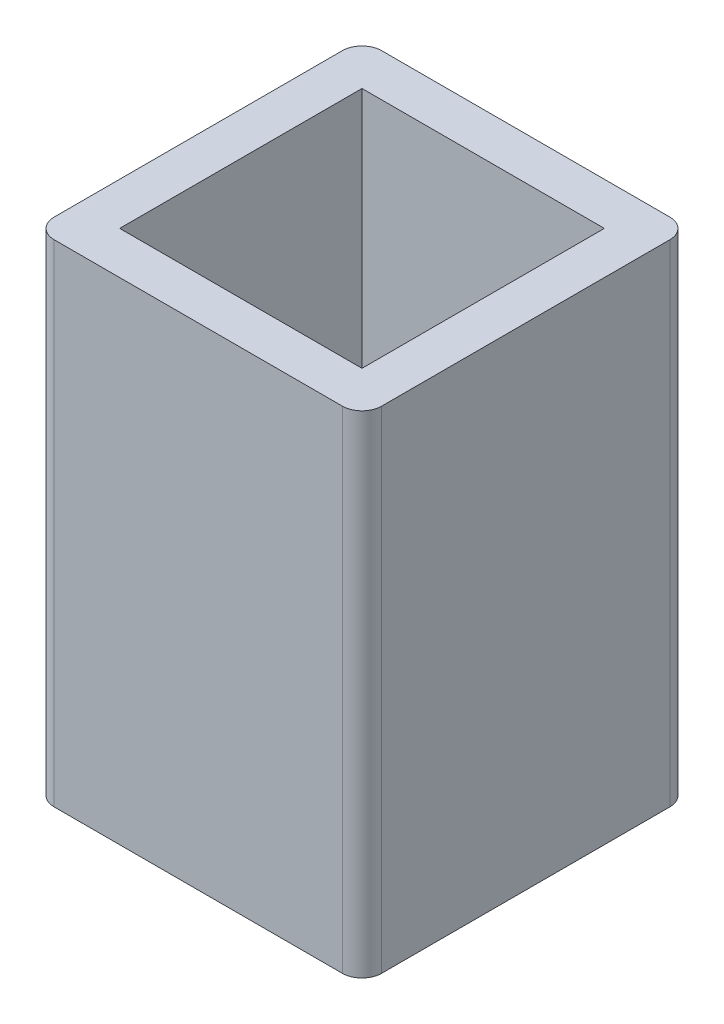
ISO-10303-21;
HEADER;
FILE_DESCRIPTION(('STEP AP214'),'2;1');
FILE_NAME('part.step','',(''),(''),'','','');
FILE_SCHEMA(('AUTOMOTIVE_DESIGN { 1 0 10303 214 1 1 1 1 }'));
ENDSEC;
DATA;
#1=APPLICATION_CONTEXT('core data for automotive mechanical design processes');
#2=APPLICATION_PROTOCOL_DEFINITION('international standard','automotive_design',2000,#1);
#3=PRODUCT_CONTEXT('',#1,'mechanical');
#4=PRODUCT('Part','Part','',(#3));
#5=PRODUCT_RELATED_PRODUCT_CATEGORY('part','',(#4));
#6=PRODUCT_DEFINITION_FORMATION('','',#4);
#7=PRODUCT_DEFINITION_CONTEXT('part definition',#1,'design');
#8=PRODUCT_DEFINITION('design','',#6,#7);
#9=PRODUCT_DEFINITION_SHAPE('','',#8);
#10=(LENGTH_UNIT() NAMED_UNIT(*) SI_UNIT(.MILLI.,.METRE.));
#11=(NAMED_UNIT(*) PLANE_ANGLE_UNIT() SI_UNIT($,.RADIAN.));
#12=(NAMED_UNIT(*) SI_UNIT($,.STERADIAN.) SOLID_ANGLE_UNIT());
#13=UNCERTAINTY_MEASURE_WITH_UNIT(LENGTH_MEASURE(1.E-05),#10,'distance_accuracy_value','');
#14=(GEOMETRIC_REPRESENTATION_CONTEXT(3) GLOBAL_UNCERTAINTY_ASSIGNED_CONTEXT((#13)) GLOBAL_UNIT_ASSIGNED_CONTEXT((#10,
#11,#12)) REPRESENTATION_CONTEXT('',''));
#15=CARTESIAN_POINT('',(0.,0.,0.));
#16=DIRECTION('',(0.,0.,1.));
#17=DIRECTION('',(1.,0.,0.));
#18=AXIS2_PLACEMENT_3D('',#15,#16,#17);
#19=CARTESIAN_POINT('',(-5.588,19.05,5.588));
#20=DIRECTION('',(0.,-1.,0.));
#21=DIRECTION('',(0.,0.,-1.));
#22=AXIS2_PLACEMENT_3D('',#19,#20,#21);
#23=PLANE('',#22);
#24=CARTESIAN_POINT('',(-5.588,19.05,5.588));
#25=DIRECTION('',(0.,1.,0.));
#26=DIRECTION('',(0.,0.,-1.));
#27=AXIS2_PLACEMENT_3D('',#24,#25,#26);
#28=CIRCLE('',#27,0.761999999999999);
#29=CARTESIAN_POINT('',(-6.35,19.05,5.588));
#30=VERTEX_POINT('',#29);
#31=CARTESIAN_POINT('',(-5.588,19.05,6.35));
#32=VERTEX_POINT('',#31);
#33=EDGE_CURVE('E168',#30,#32,#28,.T.);
#34=ORIENTED_EDGE('',*,*,#33,.T.);
#35=DIRECTION('',(1.,0.,0.));
#36=VECTOR('',#35,1.);
#37=CARTESIAN_POINT('',(-5.588,19.05,6.35));
#38=LINE('',#37,#36);
#39=CARTESIAN_POINT('',(5.588,19.05,6.35));
#40=VERTEX_POINT('',#39);
#41=EDGE_CURVE('E171',#32,#40,#38,.T.);
#42=ORIENTED_EDGE('',*,*,#41,.T.);
#43=CARTESIAN_POINT('',(5.588,19.05,5.588));
#44=DIRECTION('',(0.,1.,0.));
#45=DIRECTION('',(0.,0.,1.));
#46=AXIS2_PLACEMENT_3D('',#43,#44,#45);
#47=CIRCLE('',#46,0.761999999999999);
#48=CARTESIAN_POINT('',(6.35,19.05,5.588));
#49=VERTEX_POINT('',#48);
#50=EDGE_CURVE('E174',#40,#49,#47,.T.);
#51=ORIENTED_EDGE('',*,*,#50,.T.);
#52=DIRECTION('',(0.,0.,-1.));
#53=VECTOR('',#52,1.);
#54=CARTESIAN_POINT('',(6.35,19.05,5.588));
#55=LINE('',#54,#53);
#56=CARTESIAN_POINT('',(6.35,19.05,-5.588));
#57=VERTEX_POINT('',#56);
#58=EDGE_CURVE('E176',#49,#57,#55,.T.);
#59=ORIENTED_EDGE('',*,*,#58,.T.);
#60=CARTESIAN_POINT('',(5.588,19.05,-5.588));
#61=DIRECTION('',(0.,1.,0.));
#62=DIRECTION('',(0.,0.,-1.));
#63=AXIS2_PLACEMENT_3D('',#60,#61,#62);
#64=CIRCLE('',#63,0.761999999999999);
#65=CARTESIAN_POINT('',(5.588,19.05,-6.35));
#66=VERTEX_POINT('',#65);
#67=EDGE_CURVE('E178',#57,#66,#64,.T.);
#68=ORIENTED_EDGE('',*,*,#67,.T.);
#69=DIRECTION('',(-1.,0.,0.));
#70=VECTOR('',#69,1.);
#71=CARTESIAN_POINT('',(-5.588,19.05,-6.35));
#72=LINE('',#71,#70);
#73=CARTESIAN_POINT('',(-5.588,19.05,-6.35));
#74=VERTEX_POINT('',#73);
#75=EDGE_CURVE('E180',#66,#74,#72,.T.);
#76=ORIENTED_EDGE('',*,*,#75,.T.);
#77=CARTESIAN_POINT('',(-5.588,19.05,-5.588));
#78=DIRECTION('',(0.,1.,0.));
#79=DIRECTION('',(0.,0.,-1.));
#80=AXIS2_PLACEMENT_3D('',#77,#78,#79);
#81=CIRCLE('',#80,0.762000000000001);
#82=CARTESIAN_POINT('',(-6.35,19.05,-5.588));
#83=VERTEX_POINT('',#82);
#84=EDGE_CURVE('E182',#74,#83,#81,.T.);
#85=ORIENTED_EDGE('',*,*,#84,.T.);
#86=DIRECTION('',(0.,0.,1.));
#87=VECTOR('',#86,1.);
#88=CARTESIAN_POINT('',(-6.35,19.05,5.588));
#89=LINE('',#88,#87);
#90=EDGE_CURVE('E184',#83,#30,#89,.T.);
#91=ORIENTED_EDGE('',*,*,#90,.T.);
#92=EDGE_LOOP('',(#34,#42,#51,#59,#68,#76,#85,#91));
#93=FACE_BOUND('',#92,.T.);
#94=DIRECTION('',(1.,0.,0.));
#95=VECTOR('',#94,1.);
#96=CARTESIAN_POINT('',(-4.699,19.05,4.699));
#97=LINE('',#96,#95);
#98=CARTESIAN_POINT('',(-4.699,19.05,4.699));
#99=VERTEX_POINT('',#98);
#100=CARTESIAN_POINT('',(4.699,19.05,4.699));
#101=VERTEX_POINT('',#100);
#102=EDGE_CURVE('E132',#99,#101,#97,.T.);
#103=ORIENTED_EDGE('',*,*,#102,.F.);
#104=DIRECTION('',(0.,0.,1.));
#105=VECTOR('',#104,1.);
#106=CARTESIAN_POINT('',(-4.699,19.05,4.699));
#107=LINE('',#106,#105);
#108=CARTESIAN_POINT('',(-4.699,19.05,-4.699));
#109=VERTEX_POINT('',#108);
#110=EDGE_CURVE('E154',#109,#99,#107,.T.);
#111=ORIENTED_EDGE('',*,*,#110,.F.);
#112=DIRECTION('',(-1.,0.,0.));
#113=VECTOR('',#112,1.);
#114=CARTESIAN_POINT('',(-4.699,19.05,-4.699));
#115=LINE('',#114,#113);
#116=CARTESIAN_POINT('',(4.699,19.05,-4.699));
#117=VERTEX_POINT('',#116);
#118=EDGE_CURVE('E152',#117,#109,#115,.T.);
#119=ORIENTED_EDGE('',*,*,#118,.F.);
#120=DIRECTION('',(0.,0.,-1.));
#121=VECTOR('',#120,1.);
#122=CARTESIAN_POINT('',(4.699,19.05,4.699));
#123=LINE('',#122,#121);
#124=EDGE_CURVE('E140',#101,#117,#123,.T.);
#125=ORIENTED_EDGE('',*,*,#124,.F.);
#126=EDGE_LOOP('',(#103,#111,#119,#125));
#127=FACE_BOUND('',#126,.T.);
#128=ADVANCED_FACE('F43',(#93,#127),#23,.F.);
#129=CARTESIAN_POINT('',(-5.588,0.,5.588));
#130=DIRECTION('',(0.,-1.,0.));
#131=DIRECTION('',(0.,0.,-1.));
#132=AXIS2_PLACEMENT_3D('',#129,#130,#131);
#133=PLANE('',#132);
#134=CARTESIAN_POINT('',(-5.588,0.,5.588));
#135=DIRECTION('',(0.,1.,0.));
#136=DIRECTION('',(0.,0.,-1.));
#137=AXIS2_PLACEMENT_3D('',#134,#135,#136);
#138=CIRCLE('',#137,0.761999999999999);
#139=CARTESIAN_POINT('',(-6.35,0.,5.588));
#140=VERTEX_POINT('',#139);
#141=CARTESIAN_POINT('',(-5.588,0.,6.35));
#142=VERTEX_POINT('',#141);
#143=EDGE_CURVE('E148',#140,#142,#138,.T.);
#144=ORIENTED_EDGE('',*,*,#143,.F.);
#145=DIRECTION('',(0.,0.,1.));
#146=VECTOR('',#145,1.);
#147=CARTESIAN_POINT('',(-6.35,0.,5.588));
#148=LINE('',#147,#146);
#149=CARTESIAN_POINT('',(-6.35,0.,-5.588));
#150=VERTEX_POINT('',#149);
#151=EDGE_CURVE('E172',#150,#140,#148,.T.);
#152=ORIENTED_EDGE('',*,*,#151,.F.);
#153=CARTESIAN_POINT('',(-5.588,0.,-5.588));
#154=DIRECTION('',(0.,1.,0.));
#155=DIRECTION('',(0.,0.,-1.));
#156=AXIS2_PLACEMENT_3D('',#153,#154,#155);
#157=CIRCLE('',#156,0.762000000000001);
#158=CARTESIAN_POINT('',(-5.588,0.,-6.35));
#159=VERTEX_POINT('',#158);
#160=EDGE_CURVE('E199',#159,#150,#157,.T.);
#161=ORIENTED_EDGE('',*,*,#160,.F.);
#162=DIRECTION('',(-1.,0.,0.));
#163=VECTOR('',#162,1.);
#164=CARTESIAN_POINT('',(-5.588,0.,-6.35));
#165=LINE('',#164,#163);
#166=CARTESIAN_POINT('',(5.588,0.,-6.35));
#167=VERTEX_POINT('',#166);
#168=EDGE_CURVE('E197',#167,#159,#165,.T.);
#169=ORIENTED_EDGE('',*,*,#168,.F.);
#170=CARTESIAN_POINT('',(5.588,0.,-5.588));
#171=DIRECTION('',(0.,1.,0.));
#172=DIRECTION('',(0.,0.,-1.));
#173=AXIS2_PLACEMENT_3D('',#170,#171,#172);
#174=CIRCLE('',#173,0.761999999999999);
#175=CARTESIAN_POINT('',(6.35,0.,-5.588));
#176=VERTEX_POINT('',#175);
#177=EDGE_CURVE('E195',#176,#167,#174,.T.);
#178=ORIENTED_EDGE('',*,*,#177,.F.);
#179=DIRECTION('',(0.,0.,-1.));
#180=VECTOR('',#179,1.);
#181=CARTESIAN_POINT('',(6.35,0.,5.588));
#182=LINE('',#181,#180);
#183=CARTESIAN_POINT('',(6.35,0.,5.588));
#184=VERTEX_POINT('',#183);
#185=EDGE_CURVE('E193',#184,#176,#182,.T.);
#186=ORIENTED_EDGE('',*,*,#185,.F.);
#187=CARTESIAN_POINT('',(5.588,0.,5.588));
#188=DIRECTION('',(0.,1.,0.));
#189=DIRECTION('',(0.,0.,1.));
#190=AXIS2_PLACEMENT_3D('',#187,#188,#189);
#191=CIRCLE('',#190,0.761999999999999);
#192=CARTESIAN_POINT('',(5.588,0.,6.35));
#193=VERTEX_POINT('',#192);
#194=EDGE_CURVE('E191',#193,#184,#191,.T.);
#195=ORIENTED_EDGE('',*,*,#194,.F.);
#196=DIRECTION('',(1.,0.,0.));
#197=VECTOR('',#196,1.);
#198=CARTESIAN_POINT('',(-5.588,0.,6.35));
#199=LINE('',#198,#197);
#200=EDGE_CURVE('E189',#142,#193,#199,.T.);
#201=ORIENTED_EDGE('',*,*,#200,.F.);
#202=EDGE_LOOP('',(#144,#152,#161,#169,#178,#186,#195,#201));
#203=FACE_BOUND('',#202,.T.);
#204=DIRECTION('',(0.,0.,1.));
#205=VECTOR('',#204,1.);
#206=CARTESIAN_POINT('',(-4.699,0.,4.699));
#207=LINE('',#206,#205);
#208=CARTESIAN_POINT('',(-4.699,0.,-4.699));
#209=VERTEX_POINT('',#208);
#210=CARTESIAN_POINT('',(-4.699,0.,4.699));
#211=VERTEX_POINT('',#210);
#212=EDGE_CURVE('E141',#209,#211,#207,.T.);
#213=ORIENTED_EDGE('',*,*,#212,.T.);
#214=DIRECTION('',(1.,0.,0.));
#215=VECTOR('',#214,1.);
#216=CARTESIAN_POINT('',(-4.699,0.,4.699));
#217=LINE('',#216,#215);
#218=CARTESIAN_POINT('',(4.699,0.,4.699));
#219=VERTEX_POINT('',#218);
#220=EDGE_CURVE('E66',#211,#219,#217,.T.);
#221=ORIENTED_EDGE('',*,*,#220,.T.);
#222=DIRECTION('',(0.,0.,-1.));
#223=VECTOR('',#222,1.);
#224=CARTESIAN_POINT('',(4.699,0.,4.699));
#225=LINE('',#224,#223);
#226=CARTESIAN_POINT('',(4.699,0.,-4.699));
#227=VERTEX_POINT('',#226);
#228=EDGE_CURVE('E147',#219,#227,#225,.T.);
#229=ORIENTED_EDGE('',*,*,#228,.T.);
#230=DIRECTION('',(-1.,0.,0.));
#231=VECTOR('',#230,1.);
#232=CARTESIAN_POINT('',(-4.699,0.,-4.699));
#233=LINE('',#232,#231);
#234=EDGE_CURVE('E160',#227,#209,#233,.T.);
#235=ORIENTED_EDGE('',*,*,#234,.T.);
#236=EDGE_LOOP('',(#213,#221,#229,#235));
#237=FACE_BOUND('',#236,.T.);
#238=ADVANCED_FACE('F229',(#203,#237),#133,.T.);
#239=CARTESIAN_POINT('',(-5.588,19.05,5.588));
#240=DIRECTION('',(0.,-1.,0.));
#241=DIRECTION('',(0.,0.,-1.));
#242=AXIS2_PLACEMENT_3D('',#239,#240,#241);
#243=CYLINDRICAL_SURFACE('',#242,0.761999999999999);
#244=ORIENTED_EDGE('',*,*,#143,.T.);
#245=DIRECTION('',(0.,-1.,0.));
#246=VECTOR('',#245,1.);
#247=CARTESIAN_POINT('',(-5.588,19.05,6.35));
#248=LINE('',#247,#246);
#249=EDGE_CURVE('E11',#32,#142,#248,.T.);
#250=ORIENTED_EDGE('',*,*,#249,.F.);
#251=ORIENTED_EDGE('',*,*,#33,.F.);
#252=DIRECTION('',(0.,-1.,0.));
#253=VECTOR('',#252,1.);
#254=CARTESIAN_POINT('',(-6.35,19.05,5.588));
#255=LINE('',#254,#253);
#256=EDGE_CURVE('E186',#30,#140,#255,.T.);
#257=ORIENTED_EDGE('',*,*,#256,.T.);
#258=EDGE_LOOP('',(#244,#250,#251,#257));
#259=FACE_BOUND('',#258,.T.);
#260=ADVANCED_FACE('F45',(#259),#243,.T.);
#261=CARTESIAN_POINT('',(-5.588,19.05,6.35));
#262=DIRECTION('',(0.,0.,-1.));
#263=DIRECTION('',(-1.,0.,0.));
#264=AXIS2_PLACEMENT_3D('',#261,#262,#263);
#265=PLANE('',#264);
#266=ORIENTED_EDGE('',*,*,#200,.T.);
#267=DIRECTION('',(0.,-1.,0.));
#268=VECTOR('',#267,1.);
#269=CARTESIAN_POINT('',(5.588,19.05,6.35));
#270=LINE('',#269,#268);
#271=EDGE_CURVE('E51',#40,#193,#270,.T.);
#272=ORIENTED_EDGE('',*,*,#271,.F.);
#273=ORIENTED_EDGE('',*,*,#41,.F.);
#274=ORIENTED_EDGE('',*,*,#249,.T.);
#275=EDGE_LOOP('',(#266,#272,#273,#274));
#276=FACE_BOUND('',#275,.T.);
#277=ADVANCED_FACE('F246',(#276),#265,.F.);
#278=CARTESIAN_POINT('',(5.588,19.05,5.588));
#279=DIRECTION('',(0.,-1.,0.));
#280=DIRECTION('',(0.,0.,-1.));
#281=AXIS2_PLACEMENT_3D('',#278,#279,#280);
#282=CYLINDRICAL_SURFACE('',#281,0.761999999999999);
#283=ORIENTED_EDGE('',*,*,#194,.T.);
#284=DIRECTION('',(0.,-1.,0.));
#285=VECTOR('',#284,1.);
#286=CARTESIAN_POINT('',(6.35,19.05,5.588));
#287=LINE('',#286,#285);
#288=EDGE_CURVE('E216',#49,#184,#287,.T.);
#289=ORIENTED_EDGE('',*,*,#288,.F.);
#290=ORIENTED_EDGE('',*,*,#50,.F.);
#291=ORIENTED_EDGE('',*,*,#271,.T.);
#292=EDGE_LOOP('',(#283,#289,#290,#291));
#293=FACE_BOUND('',#292,.T.);
#294=ADVANCED_FACE('F223',(#293),#282,.T.);
#295=CARTESIAN_POINT('',(6.35,19.05,5.588));
#296=DIRECTION('',(-1.,0.,0.));
#297=DIRECTION('',(0.,0.,1.));
#298=AXIS2_PLACEMENT_3D('',#295,#296,#297);
#299=PLANE('',#298);
#300=ORIENTED_EDGE('',*,*,#185,.T.);
#301=DIRECTION('',(0.,-1.,0.));
#302=VECTOR('',#301,1.);
#303=CARTESIAN_POINT('',(6.35,19.05,-5.588));
#304=LINE('',#303,#302);
#305=EDGE_CURVE('E213',#57,#176,#304,.T.);
#306=ORIENTED_EDGE('',*,*,#305,.F.);
#307=ORIENTED_EDGE('',*,*,#58,.F.);
#308=ORIENTED_EDGE('',*,*,#288,.T.);
#309=EDGE_LOOP('',(#300,#306,#307,#308));
#310=FACE_BOUND('',#309,.T.);
#311=ADVANCED_FACE('F235',(#310),#299,.F.);
#312=CARTESIAN_POINT('',(5.588,19.05,-5.588));
#313=DIRECTION('',(0.,-1.,0.));
#314=DIRECTION('',(0.,0.,-1.));
#315=AXIS2_PLACEMENT_3D('',#312,#313,#314);
#316=CYLINDRICAL_SURFACE('',#315,0.761999999999999);
#317=ORIENTED_EDGE('',*,*,#177,.T.);
#318=DIRECTION('',(0.,-1.,0.));
#319=VECTOR('',#318,1.);
#320=CARTESIAN_POINT('',(5.588,19.05,-6.35));
#321=LINE('',#320,#319);
#322=EDGE_CURVE('E210',#66,#167,#321,.T.);
#323=ORIENTED_EDGE('',*,*,#322,.F.);
#324=ORIENTED_EDGE('',*,*,#67,.F.);
#325=ORIENTED_EDGE('',*,*,#305,.T.);
#326=EDGE_LOOP('',(#317,#323,#324,#325));
#327=FACE_BOUND('',#326,.T.);
#328=ADVANCED_FACE('F239',(#327),#316,.T.);
#329=CARTESIAN_POINT('',(-5.588,19.05,-6.35));
#330=DIRECTION('',(0.,0.,1.));
#331=DIRECTION('',(1.,0.,0.));
#332=AXIS2_PLACEMENT_3D('',#329,#330,#331);
#333=PLANE('',#332);
#334=ORIENTED_EDGE('',*,*,#168,.T.);
#335=DIRECTION('',(0.,-1.,0.));
#336=VECTOR('',#335,1.);
#337=CARTESIAN_POINT('',(-5.588,19.05,-6.35));
#338=LINE('',#337,#336);
#339=EDGE_CURVE('E207',#74,#159,#338,.T.);
#340=ORIENTED_EDGE('',*,*,#339,.F.);
#341=ORIENTED_EDGE('',*,*,#75,.F.);
#342=ORIENTED_EDGE('',*,*,#322,.T.);
#343=EDGE_LOOP('',(#334,#340,#341,#342));
#344=FACE_BOUND('',#343,.T.);
#345=ADVANCED_FACE('F259',(#344),#333,.F.);
#346=CARTESIAN_POINT('',(-5.588,19.05,-5.588));
#347=DIRECTION('',(0.,-1.,0.));
#348=DIRECTION('',(0.,0.,-1.));
#349=AXIS2_PLACEMENT_3D('',#346,#347,#348);
#350=CYLINDRICAL_SURFACE('',#349,0.762000000000001);
#351=ORIENTED_EDGE('',*,*,#160,.T.);
#352=DIRECTION('',(0.,-1.,0.));
#353=VECTOR('',#352,1.);
#354=CARTESIAN_POINT('',(-6.35,19.05,-5.588));
#355=LINE('',#354,#353);
#356=EDGE_CURVE('E204',#83,#150,#355,.T.);
#357=ORIENTED_EDGE('',*,*,#356,.F.);
#358=ORIENTED_EDGE('',*,*,#84,.F.);
#359=ORIENTED_EDGE('',*,*,#339,.T.);
#360=EDGE_LOOP('',(#351,#357,#358,#359));
#361=FACE_BOUND('',#360,.T.);
#362=ADVANCED_FACE('F257',(#361),#350,.T.);
#363=CARTESIAN_POINT('',(-6.35,19.05,5.588));
#364=DIRECTION('',(1.,0.,0.));
#365=DIRECTION('',(0.,0.,-1.));
#366=AXIS2_PLACEMENT_3D('',#363,#364,#365);
#367=PLANE('',#366);
#368=ORIENTED_EDGE('',*,*,#151,.T.);
#369=ORIENTED_EDGE('',*,*,#256,.F.);
#370=ORIENTED_EDGE('',*,*,#90,.F.);
#371=ORIENTED_EDGE('',*,*,#356,.T.);
#372=EDGE_LOOP('',(#368,#369,#370,#371));
#373=FACE_BOUND('',#372,.T.);
#374=ADVANCED_FACE('F252',(#373),#367,.F.);
#375=CARTESIAN_POINT('',(-4.699,19.05,4.699));
#376=DIRECTION('',(0.,0.,-1.));
#377=DIRECTION('',(-1.,0.,0.));
#378=AXIS2_PLACEMENT_3D('',#375,#376,#377);
#379=PLANE('',#378);
#380=ORIENTED_EDGE('',*,*,#220,.F.);
#381=DIRECTION('',(0.,-1.,0.));
#382=VECTOR('',#381,1.);
#383=CARTESIAN_POINT('',(-4.699,19.05,4.699));
#384=LINE('',#383,#382);
#385=EDGE_CURVE('E136',#99,#211,#384,.T.);
#386=ORIENTED_EDGE('',*,*,#385,.F.);
#387=ORIENTED_EDGE('',*,*,#102,.T.);
#388=DIRECTION('',(0.,-1.,0.));
#389=VECTOR('',#388,1.);
#390=CARTESIAN_POINT('',(4.699,19.05,4.699));
#391=LINE('',#390,#389);
#392=EDGE_CURVE('E135',#101,#219,#391,.T.);
#393=ORIENTED_EDGE('',*,*,#392,.T.);
#394=EDGE_LOOP('',(#380,#386,#387,#393));
#395=FACE_BOUND('',#394,.T.);
#396=ADVANCED_FACE('F134',(#395),#379,.T.);
#397=CARTESIAN_POINT('',(4.699,19.05,4.699));
#398=DIRECTION('',(-1.,0.,0.));
#399=DIRECTION('',(0.,0.,1.));
#400=AXIS2_PLACEMENT_3D('',#397,#398,#399);
#401=PLANE('',#400);
#402=ORIENTED_EDGE('',*,*,#228,.F.);
#403=ORIENTED_EDGE('',*,*,#392,.F.);
#404=ORIENTED_EDGE('',*,*,#124,.T.);
#405=DIRECTION('',(0.,-1.,0.));
#406=VECTOR('',#405,1.);
#407=CARTESIAN_POINT('',(4.699,19.05,-4.699));
#408=LINE('',#407,#406);
#409=EDGE_CURVE('E149',#117,#227,#408,.T.);
#410=ORIENTED_EDGE('',*,*,#409,.T.);
#411=EDGE_LOOP('',(#402,#403,#404,#410));
#412=FACE_BOUND('',#411,.T.);
#413=ADVANCED_FACE('F144',(#412),#401,.T.);
#414=CARTESIAN_POINT('',(-4.699,19.05,-4.699));
#415=DIRECTION('',(0.,0.,1.));
#416=DIRECTION('',(1.,0.,0.));
#417=AXIS2_PLACEMENT_3D('',#414,#415,#416);
#418=PLANE('',#417);
#419=ORIENTED_EDGE('',*,*,#234,.F.);
#420=ORIENTED_EDGE('',*,*,#409,.F.);
#421=ORIENTED_EDGE('',*,*,#118,.T.);
#422=DIRECTION('',(0.,-1.,0.));
#423=VECTOR('',#422,1.);
#424=CARTESIAN_POINT('',(-4.699,19.05,-4.699));
#425=LINE('',#424,#423);
#426=EDGE_CURVE('E58',#109,#209,#425,.T.);
#427=ORIENTED_EDGE('',*,*,#426,.T.);
#428=EDGE_LOOP('',(#419,#420,#421,#427));
#429=FACE_BOUND('',#428,.T.);
#430=ADVANCED_FACE('F284',(#429),#418,.T.);
#431=CARTESIAN_POINT('',(-4.699,19.05,4.699));
#432=DIRECTION('',(1.,0.,0.));
#433=DIRECTION('',(0.,0.,-1.));
#434=AXIS2_PLACEMENT_3D('',#431,#432,#433);
#435=PLANE('',#434);
#436=ORIENTED_EDGE('',*,*,#212,.F.);
#437=ORIENTED_EDGE('',*,*,#426,.F.);
#438=ORIENTED_EDGE('',*,*,#110,.T.);
#439=ORIENTED_EDGE('',*,*,#385,.T.);
#440=EDGE_LOOP('',(#436,#437,#438,#439));
#441=FACE_BOUND('',#440,.T.);
#442=ADVANCED_FACE('F288',(#441),#435,.T.);
#443=CLOSED_SHELL('',(#128,#238,#260,#277,#294,#311,#328,#345,#362,#374,#396,#413,#430,#442));
#444=MANIFOLD_SOLID_BREP('B2',#443);
#445=ADVANCED_BREP_SHAPE_REPRESENTATION('',(#18,#444),#14);
#446=SHAPE_DEFINITION_REPRESENTATION(#9,#445);
ENDSEC;
END-ISO-10303-21;
